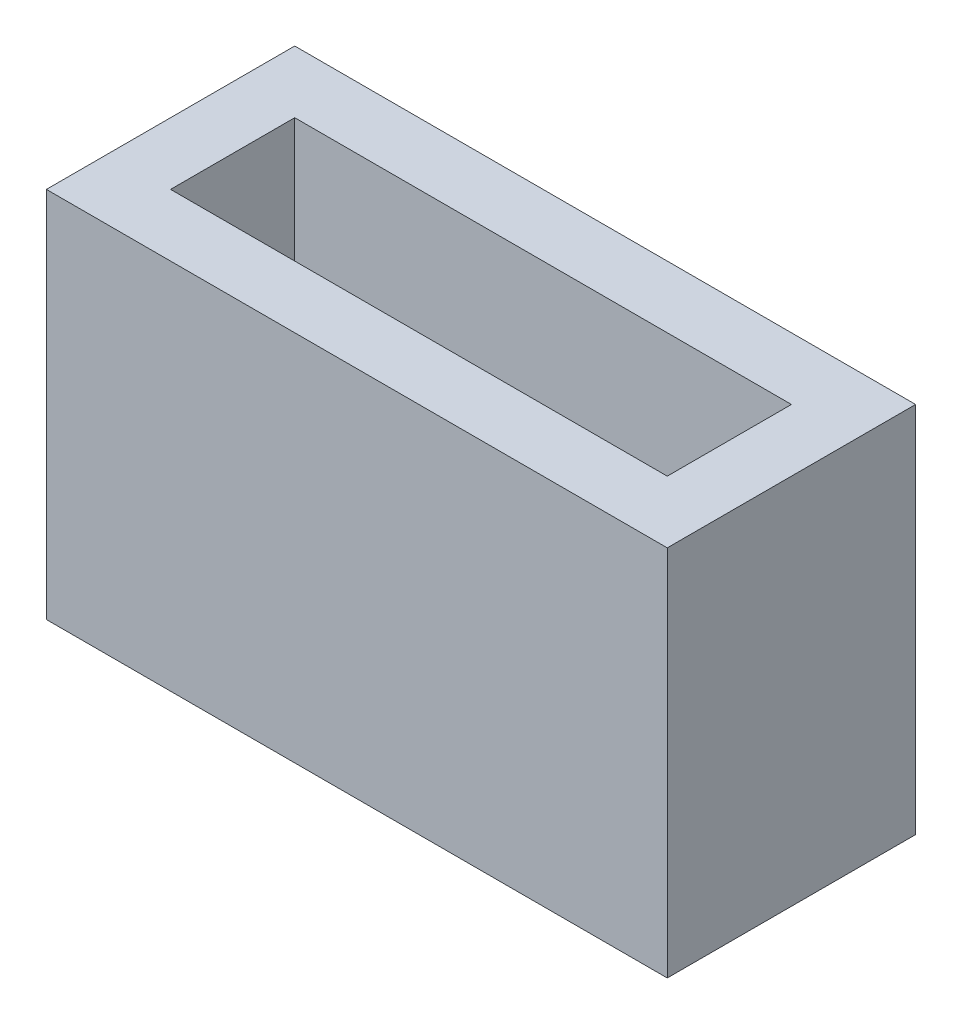
ISO-10303-21;
HEADER;
FILE_DESCRIPTION(('STEP AP214'),'2;1');
FILE_NAME('part.step','',(''),(''),'','','');
FILE_SCHEMA(('AUTOMOTIVE_DESIGN { 1 0 10303 214 1 1 1 1 }'));
ENDSEC;
DATA;
#1=APPLICATION_CONTEXT('core data for automotive mechanical design processes');
#2=APPLICATION_PROTOCOL_DEFINITION('international standard','automotive_design',2000,#1);
#3=PRODUCT_CONTEXT('',#1,'mechanical');
#4=PRODUCT('Part','Part','',(#3));
#5=PRODUCT_RELATED_PRODUCT_CATEGORY('part','',(#4));
#6=PRODUCT_DEFINITION_FORMATION('','',#4);
#7=PRODUCT_DEFINITION_CONTEXT('part definition',#1,'design');
#8=PRODUCT_DEFINITION('design','',#6,#7);
#9=PRODUCT_DEFINITION_SHAPE('','',#8);
#10=(LENGTH_UNIT() NAMED_UNIT(*) SI_UNIT(.MILLI.,.METRE.));
#11=(NAMED_UNIT(*) PLANE_ANGLE_UNIT() SI_UNIT($,.RADIAN.));
#12=(NAMED_UNIT(*) SI_UNIT($,.STERADIAN.) SOLID_ANGLE_UNIT());
#13=UNCERTAINTY_MEASURE_WITH_UNIT(LENGTH_MEASURE(1.E-05),#10,'distance_accuracy_value','');
#14=(GEOMETRIC_REPRESENTATION_CONTEXT(3) GLOBAL_UNCERTAINTY_ASSIGNED_CONTEXT((#13)) GLOBAL_UNIT_ASSIGNED_CONTEXT((#10,
#11,#12)) REPRESENTATION_CONTEXT('',''));
#15=CARTESIAN_POINT('',(0.,0.,0.));
#16=DIRECTION('',(0.,0.,1.));
#17=DIRECTION('',(1.,0.,0.));
#18=AXIS2_PLACEMENT_3D('',#15,#16,#17);
#19=CARTESIAN_POINT('',(0.,30.,0.));
#20=DIRECTION('',(0.,1.,0.));
#21=DIRECTION('',(0.,0.,1.));
#22=AXIS2_PLACEMENT_3D('',#19,#20,#21);
#23=PLANE('',#22);
#24=DIRECTION('',(0.,0.,-1.));
#25=VECTOR('',#24,1.);
#26=CARTESIAN_POINT('',(25.,30.,-10.));
#27=LINE('',#26,#25);
#28=CARTESIAN_POINT('',(25.,30.,10.));
#29=VERTEX_POINT('',#28);
#30=CARTESIAN_POINT('',(25.,30.,-10.));
#31=VERTEX_POINT('',#30);
#32=EDGE_CURVE('E139',#29,#31,#27,.T.);
#33=ORIENTED_EDGE('',*,*,#32,.T.);
#34=DIRECTION('',(-1.,0.,0.));
#35=VECTOR('',#34,1.);
#36=CARTESIAN_POINT('',(-25.,30.,-10.));
#37=LINE('',#36,#35);
#38=CARTESIAN_POINT('',(-25.,30.,-10.));
#39=VERTEX_POINT('',#38);
#40=EDGE_CURVE('E142',#31,#39,#37,.T.);
#41=ORIENTED_EDGE('',*,*,#40,.T.);
#42=DIRECTION('',(0.,0.,1.));
#43=VECTOR('',#42,1.);
#44=CARTESIAN_POINT('',(-25.,30.,-10.));
#45=LINE('',#44,#43);
#46=CARTESIAN_POINT('',(-25.,30.,10.));
#47=VERTEX_POINT('',#46);
#48=EDGE_CURVE('E145',#39,#47,#45,.T.);
#49=ORIENTED_EDGE('',*,*,#48,.T.);
#50=DIRECTION('',(1.,0.,0.));
#51=VECTOR('',#50,1.);
#52=CARTESIAN_POINT('',(-25.,30.,10.));
#53=LINE('',#52,#51);
#54=EDGE_CURVE('E147',#47,#29,#53,.T.);
#55=ORIENTED_EDGE('',*,*,#54,.T.);
#56=EDGE_LOOP('',(#33,#41,#49,#55));
#57=FACE_BOUND('',#56,.T.);
#58=DIRECTION('',(1.,0.,0.));
#59=VECTOR('',#58,1.);
#60=CARTESIAN_POINT('',(20.,30.,5.));
#61=LINE('',#60,#59);
#62=CARTESIAN_POINT('',(-20.,30.,5.));
#63=VERTEX_POINT('',#62);
#64=CARTESIAN_POINT('',(20.,30.,5.));
#65=VERTEX_POINT('',#64);
#66=EDGE_CURVE('E109',#63,#65,#61,.T.);
#67=ORIENTED_EDGE('',*,*,#66,.F.);
#68=DIRECTION('',(0.,0.,1.));
#69=VECTOR('',#68,1.);
#70=CARTESIAN_POINT('',(-20.,30.,5.));
#71=LINE('',#70,#69);
#72=CARTESIAN_POINT('',(-20.,30.,-5.));
#73=VERTEX_POINT('',#72);
#74=EDGE_CURVE('E101',#73,#63,#71,.T.);
#75=ORIENTED_EDGE('',*,*,#74,.F.);
#76=DIRECTION('',(-1.,0.,0.));
#77=VECTOR('',#76,1.);
#78=CARTESIAN_POINT('',(20.,30.,-5.));
#79=LINE('',#78,#77);
#80=CARTESIAN_POINT('',(20.,30.,-5.));
#81=VERTEX_POINT('',#80);
#82=EDGE_CURVE('E123',#81,#73,#79,.T.);
#83=ORIENTED_EDGE('',*,*,#82,.F.);
#84=DIRECTION('',(0.,0.,-1.));
#85=VECTOR('',#84,1.);
#86=CARTESIAN_POINT('',(20.,30.,5.));
#87=LINE('',#86,#85);
#88=EDGE_CURVE('E121',#65,#81,#87,.T.);
#89=ORIENTED_EDGE('',*,*,#88,.F.);
#90=EDGE_LOOP('',(#67,#75,#83,#89));
#91=FACE_BOUND('',#90,.T.);
#92=ADVANCED_FACE('F36',(#57,#91),#23,.T.);
#93=CARTESIAN_POINT('',(0.,0.,0.));
#94=DIRECTION('',(0.,1.,0.));
#95=DIRECTION('',(0.,0.,1.));
#96=AXIS2_PLACEMENT_3D('',#93,#94,#95);
#97=PLANE('',#96);
#98=DIRECTION('',(0.,0.,-1.));
#99=VECTOR('',#98,1.);
#100=CARTESIAN_POINT('',(25.,0.,-10.));
#101=LINE('',#100,#99);
#102=CARTESIAN_POINT('',(25.,0.,10.));
#103=VERTEX_POINT('',#102);
#104=CARTESIAN_POINT('',(25.,0.,-10.));
#105=VERTEX_POINT('',#104);
#106=EDGE_CURVE('E117',#103,#105,#101,.T.);
#107=ORIENTED_EDGE('',*,*,#106,.F.);
#108=DIRECTION('',(1.,0.,0.));
#109=VECTOR('',#108,1.);
#110=CARTESIAN_POINT('',(-25.,0.,10.));
#111=LINE('',#110,#109);
#112=CARTESIAN_POINT('',(-25.,0.,10.));
#113=VERTEX_POINT('',#112);
#114=EDGE_CURVE('E143',#113,#103,#111,.T.);
#115=ORIENTED_EDGE('',*,*,#114,.F.);
#116=DIRECTION('',(0.,0.,1.));
#117=VECTOR('',#116,1.);
#118=CARTESIAN_POINT('',(-25.,0.,-10.));
#119=LINE('',#118,#117);
#120=CARTESIAN_POINT('',(-25.,0.,-10.));
#121=VERTEX_POINT('',#120);
#122=EDGE_CURVE('E154',#121,#113,#119,.T.);
#123=ORIENTED_EDGE('',*,*,#122,.F.);
#124=DIRECTION('',(-1.,0.,0.));
#125=VECTOR('',#124,1.);
#126=CARTESIAN_POINT('',(-25.,0.,-10.));
#127=LINE('',#126,#125);
#128=EDGE_CURVE('E152',#105,#121,#127,.T.);
#129=ORIENTED_EDGE('',*,*,#128,.F.);
#130=EDGE_LOOP('',(#107,#115,#123,#129));
#131=FACE_BOUND('',#130,.T.);
#132=DIRECTION('',(0.,0.,1.));
#133=VECTOR('',#132,1.);
#134=CARTESIAN_POINT('',(-20.,0.,5.));
#135=LINE('',#134,#133);
#136=CARTESIAN_POINT('',(-20.,0.,-5.));
#137=VERTEX_POINT('',#136);
#138=CARTESIAN_POINT('',(-20.,0.,5.));
#139=VERTEX_POINT('',#138);
#140=EDGE_CURVE('E59',#137,#139,#135,.T.);
#141=ORIENTED_EDGE('',*,*,#140,.T.);
#142=DIRECTION('',(1.,0.,0.));
#143=VECTOR('',#142,1.);
#144=CARTESIAN_POINT('',(20.,0.,5.));
#145=LINE('',#144,#143);
#146=CARTESIAN_POINT('',(20.,0.,5.));
#147=VERTEX_POINT('',#146);
#148=EDGE_CURVE('E116',#139,#147,#145,.T.);
#149=ORIENTED_EDGE('',*,*,#148,.T.);
#150=DIRECTION('',(0.,0.,-1.));
#151=VECTOR('',#150,1.);
#152=CARTESIAN_POINT('',(20.,0.,5.));
#153=LINE('',#152,#151);
#154=CARTESIAN_POINT('',(20.,0.,-5.));
#155=VERTEX_POINT('',#154);
#156=EDGE_CURVE('E131',#147,#155,#153,.T.);
#157=ORIENTED_EDGE('',*,*,#156,.T.);
#158=DIRECTION('',(-1.,0.,0.));
#159=VECTOR('',#158,1.);
#160=CARTESIAN_POINT('',(20.,0.,-5.));
#161=LINE('',#160,#159);
#162=EDGE_CURVE('E110',#155,#137,#161,.T.);
#163=ORIENTED_EDGE('',*,*,#162,.T.);
#164=EDGE_LOOP('',(#141,#149,#157,#163));
#165=FACE_BOUND('',#164,.T.);
#166=ADVANCED_FACE('F172',(#131,#165),#97,.F.);
#167=CARTESIAN_POINT('',(25.,30.,-10.));
#168=DIRECTION('',(-1.,0.,0.));
#169=DIRECTION('',(0.,0.,1.));
#170=AXIS2_PLACEMENT_3D('',#167,#168,#169);
#171=PLANE('',#170);
#172=ORIENTED_EDGE('',*,*,#106,.T.);
#173=DIRECTION('',(0.,-1.,0.));
#174=VECTOR('',#173,1.);
#175=CARTESIAN_POINT('',(25.,30.,-10.));
#176=LINE('',#175,#174);
#177=EDGE_CURVE('E11',#31,#105,#176,.T.);
#178=ORIENTED_EDGE('',*,*,#177,.F.);
#179=ORIENTED_EDGE('',*,*,#32,.F.);
#180=DIRECTION('',(0.,-1.,0.));
#181=VECTOR('',#180,1.);
#182=CARTESIAN_POINT('',(25.,30.,10.));
#183=LINE('',#182,#181);
#184=EDGE_CURVE('E149',#29,#103,#183,.T.);
#185=ORIENTED_EDGE('',*,*,#184,.T.);
#186=EDGE_LOOP('',(#172,#178,#179,#185));
#187=FACE_BOUND('',#186,.T.);
#188=ADVANCED_FACE('F38',(#187),#171,.F.);
#189=CARTESIAN_POINT('',(-25.,30.,-10.));
#190=DIRECTION('',(0.,0.,1.));
#191=DIRECTION('',(1.,0.,0.));
#192=AXIS2_PLACEMENT_3D('',#189,#190,#191);
#193=PLANE('',#192);
#194=CARTESIAN_POINT('',(0.,15.,-10.));
#195=DIRECTION('',(0.,0.,-1.));
#196=DIRECTION('',(-1.,0.,0.));
#197=AXIS2_PLACEMENT_3D('',#194,#195,#196);
#198=CIRCLE('',#197,5.);
#199=CARTESIAN_POINT('',(-5.,15.,-10.));
#200=VERTEX_POINT('',#199);
#201=EDGE_CURVE('E227',#200,#200,#198,.T.);
#202=ORIENTED_EDGE('',*,*,#201,.F.);
#203=EDGE_LOOP('',(#202));
#204=FACE_BOUND('',#203,.T.);
#205=ORIENTED_EDGE('',*,*,#128,.T.);
#206=DIRECTION('',(0.,-1.,0.));
#207=VECTOR('',#206,1.);
#208=CARTESIAN_POINT('',(-25.,30.,-10.));
#209=LINE('',#208,#207);
#210=EDGE_CURVE('E44',#39,#121,#209,.T.);
#211=ORIENTED_EDGE('',*,*,#210,.F.);
#212=ORIENTED_EDGE('',*,*,#40,.F.);
#213=ORIENTED_EDGE('',*,*,#177,.T.);
#214=EDGE_LOOP('',(#205,#211,#212,#213));
#215=FACE_BOUND('',#214,.T.);
#216=ADVANCED_FACE('F182',(#204,#215),#193,.F.);
#217=CARTESIAN_POINT('',(-25.,30.,-10.));
#218=DIRECTION('',(1.,0.,0.));
#219=DIRECTION('',(0.,0.,-1.));
#220=AXIS2_PLACEMENT_3D('',#217,#218,#219);
#221=PLANE('',#220);
#222=ORIENTED_EDGE('',*,*,#122,.T.);
#223=DIRECTION('',(0.,-1.,0.));
#224=VECTOR('',#223,1.);
#225=CARTESIAN_POINT('',(-25.,30.,10.));
#226=LINE('',#225,#224);
#227=EDGE_CURVE('E159',#47,#113,#226,.T.);
#228=ORIENTED_EDGE('',*,*,#227,.F.);
#229=ORIENTED_EDGE('',*,*,#48,.F.);
#230=ORIENTED_EDGE('',*,*,#210,.T.);
#231=EDGE_LOOP('',(#222,#228,#229,#230));
#232=FACE_BOUND('',#231,.T.);
#233=ADVANCED_FACE('F166',(#232),#221,.F.);
#234=CARTESIAN_POINT('',(-25.,30.,10.));
#235=DIRECTION('',(0.,0.,-1.));
#236=DIRECTION('',(-1.,0.,0.));
#237=AXIS2_PLACEMENT_3D('',#234,#235,#236);
#238=PLANE('',#237);
#239=ORIENTED_EDGE('',*,*,#114,.T.);
#240=ORIENTED_EDGE('',*,*,#184,.F.);
#241=ORIENTED_EDGE('',*,*,#54,.F.);
#242=ORIENTED_EDGE('',*,*,#227,.T.);
#243=EDGE_LOOP('',(#239,#240,#241,#242));
#244=FACE_BOUND('',#243,.T.);
#245=ADVANCED_FACE('F176',(#244),#238,.F.);
#246=CARTESIAN_POINT('',(-20.,30.,5.));
#247=DIRECTION('',(1.,0.,0.));
#248=DIRECTION('',(0.,0.,-1.));
#249=AXIS2_PLACEMENT_3D('',#246,#247,#248);
#250=PLANE('',#249);
#251=ORIENTED_EDGE('',*,*,#140,.F.);
#252=DIRECTION('',(0.,-1.,0.));
#253=VECTOR('',#252,1.);
#254=CARTESIAN_POINT('',(-20.,30.,-5.));
#255=LINE('',#254,#253);
#256=EDGE_CURVE('E105',#73,#137,#255,.T.);
#257=ORIENTED_EDGE('',*,*,#256,.F.);
#258=ORIENTED_EDGE('',*,*,#74,.T.);
#259=DIRECTION('',(0.,-1.,0.));
#260=VECTOR('',#259,1.);
#261=CARTESIAN_POINT('',(-20.,30.,5.));
#262=LINE('',#261,#260);
#263=EDGE_CURVE('E104',#63,#139,#262,.T.);
#264=ORIENTED_EDGE('',*,*,#263,.T.);
#265=EDGE_LOOP('',(#251,#257,#258,#264));
#266=FACE_BOUND('',#265,.T.);
#267=ADVANCED_FACE('F103',(#266),#250,.T.);
#268=CARTESIAN_POINT('',(20.,30.,5.));
#269=DIRECTION('',(0.,0.,-1.));
#270=DIRECTION('',(-1.,0.,0.));
#271=AXIS2_PLACEMENT_3D('',#268,#269,#270);
#272=PLANE('',#271);
#273=ORIENTED_EDGE('',*,*,#148,.F.);
#274=ORIENTED_EDGE('',*,*,#263,.F.);
#275=ORIENTED_EDGE('',*,*,#66,.T.);
#276=DIRECTION('',(0.,-1.,0.));
#277=VECTOR('',#276,1.);
#278=CARTESIAN_POINT('',(20.,30.,5.));
#279=LINE('',#278,#277);
#280=EDGE_CURVE('E118',#65,#147,#279,.T.);
#281=ORIENTED_EDGE('',*,*,#280,.T.);
#282=EDGE_LOOP('',(#273,#274,#275,#281));
#283=FACE_BOUND('',#282,.T.);
#284=ADVANCED_FACE('F113',(#283),#272,.T.);
#285=CARTESIAN_POINT('',(20.,30.,5.));
#286=DIRECTION('',(-1.,0.,0.));
#287=DIRECTION('',(0.,0.,1.));
#288=AXIS2_PLACEMENT_3D('',#285,#286,#287);
#289=PLANE('',#288);
#290=ORIENTED_EDGE('',*,*,#156,.F.);
#291=ORIENTED_EDGE('',*,*,#280,.F.);
#292=ORIENTED_EDGE('',*,*,#88,.T.);
#293=DIRECTION('',(0.,-1.,0.));
#294=VECTOR('',#293,1.);
#295=CARTESIAN_POINT('',(20.,30.,-5.));
#296=LINE('',#295,#294);
#297=EDGE_CURVE('E51',#81,#155,#296,.T.);
#298=ORIENTED_EDGE('',*,*,#297,.T.);
#299=EDGE_LOOP('',(#290,#291,#292,#298));
#300=FACE_BOUND('',#299,.T.);
#301=ADVANCED_FACE('F207',(#300),#289,.T.);
#302=CARTESIAN_POINT('',(20.,30.,-5.));
#303=DIRECTION('',(0.,0.,1.));
#304=DIRECTION('',(1.,0.,0.));
#305=AXIS2_PLACEMENT_3D('',#302,#303,#304);
#306=PLANE('',#305);
#307=CARTESIAN_POINT('',(0.,15.,-5.));
#308=DIRECTION('',(0.,0.,-1.));
#309=DIRECTION('',(-1.,0.,0.));
#310=AXIS2_PLACEMENT_3D('',#307,#308,#309);
#311=CIRCLE('',#310,5.);
#312=CARTESIAN_POINT('',(-5.,15.,-5.));
#313=VERTEX_POINT('',#312);
#314=EDGE_CURVE('E129',#313,#313,#311,.T.);
#315=ORIENTED_EDGE('',*,*,#314,.T.);
#316=EDGE_LOOP('',(#315));
#317=FACE_BOUND('',#316,.T.);
#318=ORIENTED_EDGE('',*,*,#162,.F.);
#319=ORIENTED_EDGE('',*,*,#297,.F.);
#320=ORIENTED_EDGE('',*,*,#82,.T.);
#321=ORIENTED_EDGE('',*,*,#256,.T.);
#322=EDGE_LOOP('',(#318,#319,#320,#321));
#323=FACE_BOUND('',#322,.T.);
#324=ADVANCED_FACE('F211',(#317,#323),#306,.T.);
#325=CARTESIAN_POINT('',(0.,15.,-5.));
#326=DIRECTION('',(0.,0.,-1.));
#327=DIRECTION('',(-1.,0.,0.));
#328=AXIS2_PLACEMENT_3D('',#325,#326,#327);
#329=CYLINDRICAL_SURFACE('',#328,5.);
#330=ORIENTED_EDGE('',*,*,#314,.F.);
#331=EDGE_LOOP('',(#330));
#332=FACE_BOUND('',#331,.T.);
#333=ORIENTED_EDGE('',*,*,#201,.T.);
#334=EDGE_LOOP('',(#333));
#335=FACE_BOUND('',#334,.T.);
#336=ADVANCED_FACE('F217',(#332,#335),#329,.F.);
#337=CLOSED_SHELL('',(#92,#166,#188,#216,#233,#245,#267,#284,#301,#324,#336));
#338=MANIFOLD_SOLID_BREP('B2',#337);
#339=ADVANCED_BREP_SHAPE_REPRESENTATION('',(#18,#338),#14);
#340=SHAPE_DEFINITION_REPRESENTATION(#9,#339);
ENDSEC;
END-ISO-10303-21;
